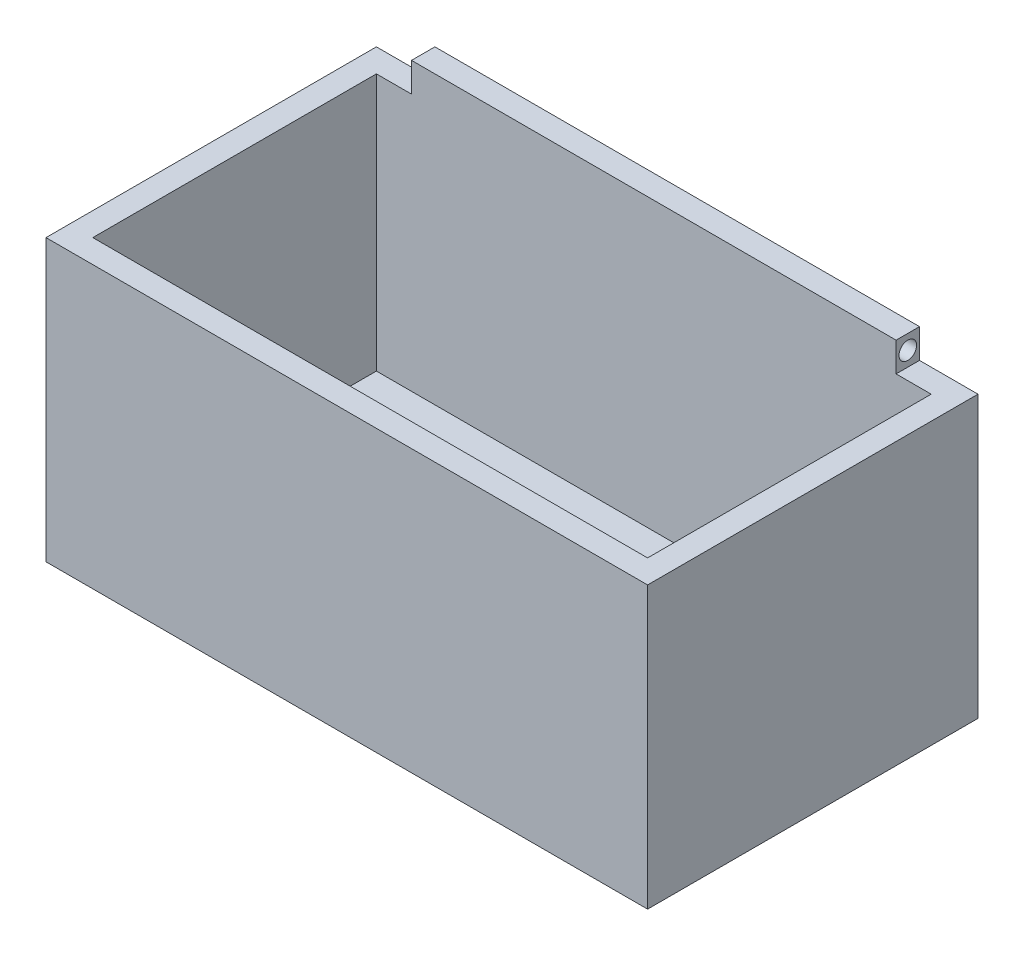
ISO-10303-21;
HEADER;
FILE_DESCRIPTION(('STEP AP214'),'2;1');
FILE_NAME('part.step','',(''),(''),'','','');
FILE_SCHEMA(('AUTOMOTIVE_DESIGN { 1 0 10303 214 1 1 1 1 }'));
ENDSEC;
DATA;
#1=APPLICATION_CONTEXT('core data for automotive mechanical design processes');
#2=APPLICATION_PROTOCOL_DEFINITION('international standard','automotive_design',2000,#1);
#3=PRODUCT_CONTEXT('',#1,'mechanical');
#4=PRODUCT('Part','Part','',(#3));
#5=PRODUCT_RELATED_PRODUCT_CATEGORY('part','',(#4));
#6=PRODUCT_DEFINITION_FORMATION('','',#4);
#7=PRODUCT_DEFINITION_CONTEXT('part definition',#1,'design');
#8=PRODUCT_DEFINITION('design','',#6,#7);
#9=PRODUCT_DEFINITION_SHAPE('','',#8);
#10=(LENGTH_UNIT() NAMED_UNIT(*) SI_UNIT(.MILLI.,.METRE.));
#11=(NAMED_UNIT(*) PLANE_ANGLE_UNIT() SI_UNIT($,.RADIAN.));
#12=(NAMED_UNIT(*) SI_UNIT($,.STERADIAN.) SOLID_ANGLE_UNIT());
#13=UNCERTAINTY_MEASURE_WITH_UNIT(LENGTH_MEASURE(1.E-05),#10,'distance_accuracy_value','');
#14=(GEOMETRIC_REPRESENTATION_CONTEXT(3) GLOBAL_UNCERTAINTY_ASSIGNED_CONTEXT((#13)) GLOBAL_UNIT_ASSIGNED_CONTEXT((#10,
#11,#12)) REPRESENTATION_CONTEXT('',''));
#15=CARTESIAN_POINT('',(0.,0.,0.));
#16=DIRECTION('',(0.,0.,1.));
#17=DIRECTION('',(1.,0.,0.));
#18=AXIS2_PLACEMENT_3D('',#15,#16,#17);
#19=CARTESIAN_POINT('',(-326.517,152.4,358.648));
#20=DIRECTION('',(0.,-1.,0.));
#21=DIRECTION('',(0.,0.,-1.));
#22=AXIS2_PLACEMENT_3D('',#19,#20,#21);
#23=PLANE('',#22);
#24=DIRECTION('',(0.,0.,-1.));
#25=VECTOR('',#24,1.);
#26=CARTESIAN_POINT('',(263.017,152.4,25.4));
#27=LINE('',#26,#25);
#28=CARTESIAN_POINT('',(263.017,152.4,25.4));
#29=VERTEX_POINT('',#28);
#30=CARTESIAN_POINT('',(263.017,152.4,0.));
#31=VERTEX_POINT('',#30);
#32=EDGE_CURVE('E56',#29,#31,#27,.T.);
#33=ORIENTED_EDGE('',*,*,#32,.F.);
#34=DIRECTION('',(-1.,0.,0.));
#35=VECTOR('',#34,1.);
#36=CARTESIAN_POINT('',(0.,152.4,25.4));
#37=LINE('',#36,#35);
#38=CARTESIAN_POINT('',(301.117,152.4,25.4));
#39=VERTEX_POINT('',#38);
#40=EDGE_CURVE('E178',#39,#29,#37,.T.);
#41=ORIENTED_EDGE('',*,*,#40,.F.);
#42=DIRECTION('',(0.,0.,-1.));
#43=VECTOR('',#42,1.);
#44=CARTESIAN_POINT('',(301.117,152.4,358.648));
#45=LINE('',#44,#43);
#46=CARTESIAN_POINT('',(301.117,152.4,333.248));
#47=VERTEX_POINT('',#46);
#48=EDGE_CURVE('E180',#47,#39,#45,.T.);
#49=ORIENTED_EDGE('',*,*,#48,.F.);
#50=DIRECTION('',(-1.,0.,0.));
#51=VECTOR('',#50,1.);
#52=CARTESIAN_POINT('',(0.,152.4,333.248));
#53=LINE('',#52,#51);
#54=CARTESIAN_POINT('',(-301.117,152.4,333.248));
#55=VERTEX_POINT('',#54);
#56=EDGE_CURVE('E163',#47,#55,#53,.T.);
#57=ORIENTED_EDGE('',*,*,#56,.T.);
#58=DIRECTION('',(0.,0.,-1.));
#59=VECTOR('',#58,1.);
#60=CARTESIAN_POINT('',(-301.117,152.4,358.648));
#61=LINE('',#60,#59);
#62=CARTESIAN_POINT('',(-301.117,152.4,25.4));
#63=VERTEX_POINT('',#62);
#64=EDGE_CURVE('E176',#55,#63,#61,.T.);
#65=ORIENTED_EDGE('',*,*,#64,.T.);
#66=CARTESIAN_POINT('',(-263.017,152.4,25.4));
#67=VERTEX_POINT('',#66);
#68=EDGE_CURVE('E155',#67,#63,#37,.T.);
#69=ORIENTED_EDGE('',*,*,#68,.F.);
#70=DIRECTION('',(0.,0.,1.));
#71=VECTOR('',#70,1.);
#72=CARTESIAN_POINT('',(-263.017,152.4,0.));
#73=LINE('',#72,#71);
#74=CARTESIAN_POINT('',(-263.017,152.4,0.));
#75=VERTEX_POINT('',#74);
#76=EDGE_CURVE('E63',#75,#67,#73,.T.);
#77=ORIENTED_EDGE('',*,*,#76,.F.);
#78=DIRECTION('',(-1.,0.,0.));
#79=VECTOR('',#78,1.);
#80=CARTESIAN_POINT('',(-326.517,152.4,0.));
#81=LINE('',#80,#79);
#82=CARTESIAN_POINT('',(-326.517,152.4,0.));
#83=VERTEX_POINT('',#82);
#84=EDGE_CURVE('E201',#75,#83,#81,.T.);
#85=ORIENTED_EDGE('',*,*,#84,.T.);
#86=DIRECTION('',(0.,0.,-1.));
#87=VECTOR('',#86,1.);
#88=CARTESIAN_POINT('',(-326.517,152.4,358.648));
#89=LINE('',#88,#87);
#90=CARTESIAN_POINT('',(-326.517,152.4,358.648));
#91=VERTEX_POINT('',#90);
#92=EDGE_CURVE('E49',#91,#83,#89,.T.);
#93=ORIENTED_EDGE('',*,*,#92,.F.);
#94=DIRECTION('',(-1.,0.,0.));
#95=VECTOR('',#94,1.);
#96=CARTESIAN_POINT('',(-326.517,152.4,358.648));
#97=LINE('',#96,#95);
#98=CARTESIAN_POINT('',(326.517,152.4,358.648));
#99=VERTEX_POINT('',#98);
#100=EDGE_CURVE('E191',#99,#91,#97,.T.);
#101=ORIENTED_EDGE('',*,*,#100,.F.);
#102=DIRECTION('',(0.,0.,-1.));
#103=VECTOR('',#102,1.);
#104=CARTESIAN_POINT('',(326.517,152.4,358.648));
#105=LINE('',#104,#103);
#106=CARTESIAN_POINT('',(326.517,152.4,0.));
#107=VERTEX_POINT('',#106);
#108=EDGE_CURVE('E11',#99,#107,#105,.T.);
#109=ORIENTED_EDGE('',*,*,#108,.T.);
#110=EDGE_CURVE('E202',#107,#31,#81,.T.);
#111=ORIENTED_EDGE('',*,*,#110,.T.);
#112=EDGE_LOOP('',(#33,#41,#49,#57,#65,#69,#77,#85,#93,#101,#109,#111));
#113=FACE_BOUND('',#112,.T.);
#114=ADVANCED_FACE('F41',(#113),#23,.F.);
#115=CARTESIAN_POINT('',(326.517,-152.4,358.648));
#116=DIRECTION('',(-1.,0.,0.));
#117=DIRECTION('',(0.,0.,1.));
#118=AXIS2_PLACEMENT_3D('',#115,#116,#117);
#119=PLANE('',#118);
#120=DIRECTION('',(0.,1.,0.));
#121=VECTOR('',#120,1.);
#122=CARTESIAN_POINT('',(326.517,-152.4,0.));
#123=LINE('',#122,#121);
#124=CARTESIAN_POINT('',(326.517,-152.4,0.));
#125=VERTEX_POINT('',#124);
#126=EDGE_CURVE('E182',#125,#107,#123,.T.);
#127=ORIENTED_EDGE('',*,*,#126,.T.);
#128=ORIENTED_EDGE('',*,*,#108,.F.);
#129=DIRECTION('',(0.,1.,0.));
#130=VECTOR('',#129,1.);
#131=CARTESIAN_POINT('',(326.517,-152.4,358.648));
#132=LINE('',#131,#130);
#133=CARTESIAN_POINT('',(326.517,-152.4,358.648));
#134=VERTEX_POINT('',#133);
#135=EDGE_CURVE('E188',#134,#99,#132,.T.);
#136=ORIENTED_EDGE('',*,*,#135,.F.);
#137=DIRECTION('',(0.,0.,-1.));
#138=VECTOR('',#137,1.);
#139=CARTESIAN_POINT('',(326.517,-152.4,358.648));
#140=LINE('',#139,#138);
#141=EDGE_CURVE('E198',#134,#125,#140,.T.);
#142=ORIENTED_EDGE('',*,*,#141,.T.);
#143=EDGE_LOOP('',(#127,#128,#136,#142));
#144=FACE_BOUND('',#143,.T.);
#145=ADVANCED_FACE('F43',(#144),#119,.F.);
#146=CARTESIAN_POINT('',(-326.517,-152.4,358.648));
#147=DIRECTION('',(1.,0.,0.));
#148=DIRECTION('',(0.,0.,-1.));
#149=AXIS2_PLACEMENT_3D('',#146,#147,#148);
#150=PLANE('',#149);
#151=DIRECTION('',(0.,-1.,0.));
#152=VECTOR('',#151,1.);
#153=CARTESIAN_POINT('',(-326.517,-152.4,0.));
#154=LINE('',#153,#152);
#155=CARTESIAN_POINT('',(-326.517,-152.4,0.));
#156=VERTEX_POINT('',#155);
#157=EDGE_CURVE('E204',#83,#156,#154,.T.);
#158=ORIENTED_EDGE('',*,*,#157,.T.);
#159=DIRECTION('',(0.,0.,-1.));
#160=VECTOR('',#159,1.);
#161=CARTESIAN_POINT('',(-326.517,-152.4,358.648));
#162=LINE('',#161,#160);
#163=CARTESIAN_POINT('',(-326.517,-152.4,358.648));
#164=VERTEX_POINT('',#163);
#165=EDGE_CURVE('E209',#164,#156,#162,.T.);
#166=ORIENTED_EDGE('',*,*,#165,.F.);
#167=DIRECTION('',(0.,-1.,0.));
#168=VECTOR('',#167,1.);
#169=CARTESIAN_POINT('',(-326.517,-152.4,358.648));
#170=LINE('',#169,#168);
#171=EDGE_CURVE('E194',#91,#164,#170,.T.);
#172=ORIENTED_EDGE('',*,*,#171,.F.);
#173=ORIENTED_EDGE('',*,*,#92,.T.);
#174=EDGE_LOOP('',(#158,#166,#172,#173));
#175=FACE_BOUND('',#174,.T.);
#176=ADVANCED_FACE('F216',(#175),#150,.F.);
#177=CARTESIAN_POINT('',(-326.517,-152.4,358.648));
#178=DIRECTION('',(0.,1.,0.));
#179=DIRECTION('',(0.,0.,1.));
#180=AXIS2_PLACEMENT_3D('',#177,#178,#179);
#181=PLANE('',#180);
#182=DIRECTION('',(1.,0.,0.));
#183=VECTOR('',#182,1.);
#184=CARTESIAN_POINT('',(-326.517,-152.4,0.));
#185=LINE('',#184,#183);
#186=EDGE_CURVE('E192',#156,#125,#185,.T.);
#187=ORIENTED_EDGE('',*,*,#186,.T.);
#188=ORIENTED_EDGE('',*,*,#141,.F.);
#189=DIRECTION('',(1.,0.,0.));
#190=VECTOR('',#189,1.);
#191=CARTESIAN_POINT('',(-326.517,-152.4,358.648));
#192=LINE('',#191,#190);
#193=EDGE_CURVE('E196',#164,#134,#192,.T.);
#194=ORIENTED_EDGE('',*,*,#193,.F.);
#195=ORIENTED_EDGE('',*,*,#165,.T.);
#196=EDGE_LOOP('',(#187,#188,#194,#195));
#197=FACE_BOUND('',#196,.T.);
#198=ADVANCED_FACE('F221',(#197),#181,.F.);
#199=CARTESIAN_POINT('',(0.,0.,358.648));
#200=DIRECTION('',(0.,0.,-1.));
#201=DIRECTION('',(-1.,0.,0.));
#202=AXIS2_PLACEMENT_3D('',#199,#200,#201);
#203=PLANE('',#202);
#204=ORIENTED_EDGE('',*,*,#135,.T.);
#205=ORIENTED_EDGE('',*,*,#100,.T.);
#206=ORIENTED_EDGE('',*,*,#171,.T.);
#207=ORIENTED_EDGE('',*,*,#193,.T.);
#208=EDGE_LOOP('',(#204,#205,#206,#207));
#209=FACE_BOUND('',#208,.T.);
#210=ADVANCED_FACE('F227',(#209),#203,.F.);
#211=CARTESIAN_POINT('',(0.,0.,0.));
#212=DIRECTION('',(0.,0.,-1.));
#213=DIRECTION('',(-1.,0.,0.));
#214=AXIS2_PLACEMENT_3D('',#211,#212,#213);
#215=PLANE('',#214);
#216=ORIENTED_EDGE('',*,*,#126,.F.);
#217=ORIENTED_EDGE('',*,*,#186,.F.);
#218=ORIENTED_EDGE('',*,*,#157,.F.);
#219=ORIENTED_EDGE('',*,*,#84,.F.);
#220=DIRECTION('',(0.,-1.,0.));
#221=VECTOR('',#220,1.);
#222=CARTESIAN_POINT('',(-263.017,184.15,0.));
#223=LINE('',#222,#221);
#224=CARTESIAN_POINT('',(-263.017,184.15,0.));
#225=VERTEX_POINT('',#224);
#226=EDGE_CURVE('E137',#225,#75,#223,.T.);
#227=ORIENTED_EDGE('',*,*,#226,.F.);
#228=DIRECTION('',(-1.,0.,0.));
#229=VECTOR('',#228,1.);
#230=CARTESIAN_POINT('',(-263.017,184.15,0.));
#231=LINE('',#230,#229);
#232=CARTESIAN_POINT('',(263.017,184.15,-1.62114604292954E-13));
#233=VERTEX_POINT('',#232);
#234=EDGE_CURVE('E130',#233,#225,#231,.T.);
#235=ORIENTED_EDGE('',*,*,#234,.F.);
#236=DIRECTION('',(0.,-1.,0.));
#237=VECTOR('',#236,1.);
#238=CARTESIAN_POINT('',(263.017,184.15,-1.62114604292954E-13));
#239=LINE('',#238,#237);
#240=EDGE_CURVE('E135',#233,#31,#239,.T.);
#241=ORIENTED_EDGE('',*,*,#240,.T.);
#242=ORIENTED_EDGE('',*,*,#110,.F.);
#243=EDGE_LOOP('',(#216,#217,#218,#219,#227,#235,#241,#242));
#244=FACE_BOUND('',#243,.T.);
#245=ADVANCED_FACE('F133',(#244),#215,.T.);
#246=CARTESIAN_POINT('',(301.117,-152.4,358.648));
#247=DIRECTION('',(-1.,0.,0.));
#248=DIRECTION('',(0.,0.,1.));
#249=AXIS2_PLACEMENT_3D('',#246,#247,#248);
#250=PLANE('',#249);
#251=DIRECTION('',(0.,1.,0.));
#252=VECTOR('',#251,1.);
#253=CARTESIAN_POINT('',(301.117,0.,25.4));
#254=LINE('',#253,#252);
#255=CARTESIAN_POINT('',(301.117,-127.,25.4));
#256=VERTEX_POINT('',#255);
#257=EDGE_CURVE('E152',#256,#39,#254,.T.);
#258=ORIENTED_EDGE('',*,*,#257,.F.);
#259=DIRECTION('',(0.,0.,-1.));
#260=VECTOR('',#259,1.);
#261=CARTESIAN_POINT('',(301.117,-127.,358.648));
#262=LINE('',#261,#260);
#263=CARTESIAN_POINT('',(301.117,-127.,333.248));
#264=VERTEX_POINT('',#263);
#265=EDGE_CURVE('E165',#264,#256,#262,.T.);
#266=ORIENTED_EDGE('',*,*,#265,.F.);
#267=DIRECTION('',(0.,1.,0.));
#268=VECTOR('',#267,1.);
#269=CARTESIAN_POINT('',(301.117,0.,333.248));
#270=LINE('',#269,#268);
#271=EDGE_CURVE('E161',#264,#47,#270,.T.);
#272=ORIENTED_EDGE('',*,*,#271,.T.);
#273=ORIENTED_EDGE('',*,*,#48,.T.);
#274=EDGE_LOOP('',(#258,#266,#272,#273));
#275=FACE_BOUND('',#274,.T.);
#276=ADVANCED_FACE('F240',(#275),#250,.T.);
#277=CARTESIAN_POINT('',(-301.117,-152.4,358.648));
#278=DIRECTION('',(1.,0.,0.));
#279=DIRECTION('',(0.,0.,-1.));
#280=AXIS2_PLACEMENT_3D('',#277,#278,#279);
#281=PLANE('',#280);
#282=DIRECTION('',(0.,-1.,0.));
#283=VECTOR('',#282,1.);
#284=CARTESIAN_POINT('',(-301.117,0.,25.4));
#285=LINE('',#284,#283);
#286=CARTESIAN_POINT('',(-301.117,-127.,25.4));
#287=VERTEX_POINT('',#286);
#288=EDGE_CURVE('E171',#63,#287,#285,.T.);
#289=ORIENTED_EDGE('',*,*,#288,.F.);
#290=ORIENTED_EDGE('',*,*,#64,.F.);
#291=DIRECTION('',(0.,-1.,0.));
#292=VECTOR('',#291,1.);
#293=CARTESIAN_POINT('',(-301.117,0.,333.248));
#294=LINE('',#293,#292);
#295=CARTESIAN_POINT('',(-301.117,-127.,333.248));
#296=VERTEX_POINT('',#295);
#297=EDGE_CURVE('E173',#55,#296,#294,.T.);
#298=ORIENTED_EDGE('',*,*,#297,.T.);
#299=DIRECTION('',(0.,0.,-1.));
#300=VECTOR('',#299,1.);
#301=CARTESIAN_POINT('',(-301.117,-127.,358.648));
#302=LINE('',#301,#300);
#303=EDGE_CURVE('E168',#296,#287,#302,.T.);
#304=ORIENTED_EDGE('',*,*,#303,.T.);
#305=EDGE_LOOP('',(#289,#290,#298,#304));
#306=FACE_BOUND('',#305,.T.);
#307=ADVANCED_FACE('F253',(#306),#281,.T.);
#308=CARTESIAN_POINT('',(-326.517,-127.,358.648));
#309=DIRECTION('',(0.,1.,0.));
#310=DIRECTION('',(0.,0.,1.));
#311=AXIS2_PLACEMENT_3D('',#308,#309,#310);
#312=PLANE('',#311);
#313=DIRECTION('',(1.,0.,0.));
#314=VECTOR('',#313,1.);
#315=CARTESIAN_POINT('',(0.,-127.,25.4));
#316=LINE('',#315,#314);
#317=EDGE_CURVE('E164',#287,#256,#316,.T.);
#318=ORIENTED_EDGE('',*,*,#317,.F.);
#319=ORIENTED_EDGE('',*,*,#303,.F.);
#320=DIRECTION('',(1.,0.,0.));
#321=VECTOR('',#320,1.);
#322=CARTESIAN_POINT('',(0.,-127.,333.248));
#323=LINE('',#322,#321);
#324=EDGE_CURVE('E169',#296,#264,#323,.T.);
#325=ORIENTED_EDGE('',*,*,#324,.T.);
#326=ORIENTED_EDGE('',*,*,#265,.T.);
#327=EDGE_LOOP('',(#318,#319,#325,#326));
#328=FACE_BOUND('',#327,.T.);
#329=ADVANCED_FACE('F249',(#328),#312,.T.);
#330=CARTESIAN_POINT('',(0.,0.,333.248));
#331=DIRECTION('',(0.,0.,-1.));
#332=DIRECTION('',(-1.,0.,0.));
#333=AXIS2_PLACEMENT_3D('',#330,#331,#332);
#334=PLANE('',#333);
#335=ORIENTED_EDGE('',*,*,#271,.F.);
#336=ORIENTED_EDGE('',*,*,#324,.F.);
#337=ORIENTED_EDGE('',*,*,#297,.F.);
#338=ORIENTED_EDGE('',*,*,#56,.F.);
#339=EDGE_LOOP('',(#335,#336,#337,#338));
#340=FACE_BOUND('',#339,.T.);
#341=ADVANCED_FACE('F246',(#340),#334,.T.);
#342=CARTESIAN_POINT('',(0.,0.,25.4));
#343=DIRECTION('',(0.,0.,-1.));
#344=DIRECTION('',(-1.,0.,0.));
#345=AXIS2_PLACEMENT_3D('',#342,#343,#344);
#346=PLANE('',#345);
#347=ORIENTED_EDGE('',*,*,#257,.T.);
#348=ORIENTED_EDGE('',*,*,#40,.T.);
#349=DIRECTION('',(0.,-1.,0.));
#350=VECTOR('',#349,1.);
#351=CARTESIAN_POINT('',(263.017,184.15,25.4));
#352=LINE('',#351,#350);
#353=CARTESIAN_POINT('',(263.017,184.15,25.4));
#354=VERTEX_POINT('',#353);
#355=EDGE_CURVE('E303',#354,#29,#352,.T.);
#356=ORIENTED_EDGE('',*,*,#355,.F.);
#357=DIRECTION('',(1.,0.,0.));
#358=VECTOR('',#357,1.);
#359=CARTESIAN_POINT('',(-263.017,184.15,25.4));
#360=LINE('',#359,#358);
#361=CARTESIAN_POINT('',(-263.017,184.15,25.4));
#362=VERTEX_POINT('',#361);
#363=EDGE_CURVE('E146',#362,#354,#360,.T.);
#364=ORIENTED_EDGE('',*,*,#363,.F.);
#365=DIRECTION('',(0.,-1.,0.));
#366=VECTOR('',#365,1.);
#367=CARTESIAN_POINT('',(-263.017,184.15,25.4));
#368=LINE('',#367,#366);
#369=EDGE_CURVE('E157',#362,#67,#368,.T.);
#370=ORIENTED_EDGE('',*,*,#369,.T.);
#371=ORIENTED_EDGE('',*,*,#68,.T.);
#372=ORIENTED_EDGE('',*,*,#288,.T.);
#373=ORIENTED_EDGE('',*,*,#317,.T.);
#374=EDGE_LOOP('',(#347,#348,#356,#364,#370,#371,#372,#373));
#375=FACE_BOUND('',#374,.T.);
#376=ADVANCED_FACE('F243',(#375),#346,.F.);
#377=CARTESIAN_POINT('',(263.017,184.15,25.4));
#378=DIRECTION('',(-1.,0.,0.));
#379=DIRECTION('',(0.,0.,1.));
#380=AXIS2_PLACEMENT_3D('',#377,#378,#379);
#381=PLANE('',#380);
#382=CARTESIAN_POINT('',(263.017,168.275,12.6999999999999));
#383=DIRECTION('',(1.,0.,0.));
#384=DIRECTION('',(0.,0.,-1.));
#385=AXIS2_PLACEMENT_3D('',#382,#383,#384);
#386=CIRCLE('',#385,9.525);
#387=CARTESIAN_POINT('',(263.017,168.275,3.17499999999992));
#388=VERTEX_POINT('',#387);
#389=EDGE_CURVE('E290',#388,#388,#386,.T.);
#390=ORIENTED_EDGE('',*,*,#389,.F.);
#391=EDGE_LOOP('',(#390));
#392=FACE_BOUND('',#391,.T.);
#393=ORIENTED_EDGE('',*,*,#32,.T.);
#394=ORIENTED_EDGE('',*,*,#240,.F.);
#395=DIRECTION('',(0.,0.,-1.));
#396=VECTOR('',#395,1.);
#397=CARTESIAN_POINT('',(263.017,184.15,25.4));
#398=LINE('',#397,#396);
#399=EDGE_CURVE('E141',#354,#233,#398,.T.);
#400=ORIENTED_EDGE('',*,*,#399,.F.);
#401=ORIENTED_EDGE('',*,*,#355,.T.);
#402=EDGE_LOOP('',(#393,#394,#400,#401));
#403=FACE_BOUND('',#402,.T.);
#404=ADVANCED_FACE('F151',(#392,#403),#381,.F.);
#405=CARTESIAN_POINT('',(-263.017,184.15,0.));
#406=DIRECTION('',(1.,0.,0.));
#407=DIRECTION('',(0.,0.,-1.));
#408=AXIS2_PLACEMENT_3D('',#405,#406,#407);
#409=PLANE('',#408);
#410=CARTESIAN_POINT('',(-263.017,168.275,12.6999999999999));
#411=DIRECTION('',(1.,0.,0.));
#412=DIRECTION('',(0.,0.,-1.));
#413=AXIS2_PLACEMENT_3D('',#410,#411,#412);
#414=CIRCLE('',#413,9.525);
#415=CARTESIAN_POINT('',(-263.017,168.275,3.17499999999992));
#416=VERTEX_POINT('',#415);
#417=EDGE_CURVE('E291',#416,#416,#414,.T.);
#418=ORIENTED_EDGE('',*,*,#417,.T.);
#419=EDGE_LOOP('',(#418));
#420=FACE_BOUND('',#419,.T.);
#421=ORIENTED_EDGE('',*,*,#76,.T.);
#422=ORIENTED_EDGE('',*,*,#369,.F.);
#423=DIRECTION('',(0.,0.,1.));
#424=VECTOR('',#423,1.);
#425=CARTESIAN_POINT('',(-263.017,184.15,0.));
#426=LINE('',#425,#424);
#427=EDGE_CURVE('E140',#225,#362,#426,.T.);
#428=ORIENTED_EDGE('',*,*,#427,.F.);
#429=ORIENTED_EDGE('',*,*,#226,.T.);
#430=EDGE_LOOP('',(#421,#422,#428,#429));
#431=FACE_BOUND('',#430,.T.);
#432=ADVANCED_FACE('F263',(#420,#431),#409,.F.);
#433=CARTESIAN_POINT('',(0.,184.15,0.));
#434=DIRECTION('',(0.,-1.,0.));
#435=DIRECTION('',(0.,0.,-1.));
#436=AXIS2_PLACEMENT_3D('',#433,#434,#435);
#437=PLANE('',#436);
#438=ORIENTED_EDGE('',*,*,#399,.T.);
#439=ORIENTED_EDGE('',*,*,#234,.T.);
#440=ORIENTED_EDGE('',*,*,#427,.T.);
#441=ORIENTED_EDGE('',*,*,#363,.T.);
#442=EDGE_LOOP('',(#438,#439,#440,#441));
#443=FACE_BOUND('',#442,.T.);
#444=ADVANCED_FACE('F144',(#443),#437,.F.);
#445=CARTESIAN_POINT('',(237.617,168.275,12.6999999999999));
#446=DIRECTION('',(1.,0.,0.));
#447=DIRECTION('',(0.,0.,-1.));
#448=AXIS2_PLACEMENT_3D('',#445,#446,#447);
#449=CYLINDRICAL_SURFACE('',#448,9.525);
#450=CARTESIAN_POINT('',(237.617,168.275,12.6999999999999));
#451=DIRECTION('',(1.,0.,0.));
#452=DIRECTION('',(0.,0.,-1.));
#453=AXIS2_PLACEMENT_3D('',#450,#451,#452);
#454=CIRCLE('',#453,9.525);
#455=CARTESIAN_POINT('',(237.617,168.275,3.17499999999992));
#456=VERTEX_POINT('',#455);
#457=EDGE_CURVE('E294',#456,#456,#454,.T.);
#458=ORIENTED_EDGE('',*,*,#457,.F.);
#459=EDGE_LOOP('',(#458));
#460=FACE_BOUND('',#459,.T.);
#461=ORIENTED_EDGE('',*,*,#389,.T.);
#462=EDGE_LOOP('',(#461));
#463=FACE_BOUND('',#462,.T.);
#464=ADVANCED_FACE('F270',(#460,#463),#449,.F.);
#465=CARTESIAN_POINT('',(237.617,168.275,12.6999999999999));
#466=DIRECTION('',(1.,0.,0.));
#467=DIRECTION('',(0.,0.,-1.));
#468=AXIS2_PLACEMENT_3D('',#465,#466,#467);
#469=PLANE('',#468);
#470=ORIENTED_EDGE('',*,*,#457,.T.);
#471=EDGE_LOOP('',(#470));
#472=FACE_BOUND('',#471,.T.);
#473=ADVANCED_FACE('F273',(#472),#469,.T.);
#474=CARTESIAN_POINT('',(-237.617,168.275,12.6999999999999));
#475=DIRECTION('',(-1.,0.,0.));
#476=DIRECTION('',(0.,0.,1.));
#477=AXIS2_PLACEMENT_3D('',#474,#475,#476);
#478=CYLINDRICAL_SURFACE('',#477,9.525);
#479=CARTESIAN_POINT('',(-237.617,168.275,12.6999999999999));
#480=DIRECTION('',(1.,0.,0.));
#481=DIRECTION('',(0.,0.,-1.));
#482=AXIS2_PLACEMENT_3D('',#479,#480,#481);
#483=CIRCLE('',#482,9.525);
#484=CARTESIAN_POINT('',(-237.617,168.275,3.17499999999992));
#485=VERTEX_POINT('',#484);
#486=EDGE_CURVE('E289',#485,#485,#483,.T.);
#487=ORIENTED_EDGE('',*,*,#486,.T.);
#488=EDGE_LOOP('',(#487));
#489=FACE_BOUND('',#488,.T.);
#490=ORIENTED_EDGE('',*,*,#417,.F.);
#491=EDGE_LOOP('',(#490));
#492=FACE_BOUND('',#491,.T.);
#493=ADVANCED_FACE('F277',(#489,#492),#478,.F.);
#494=CARTESIAN_POINT('',(-237.617,168.275,12.6999999999999));
#495=DIRECTION('',(-1.,0.,0.));
#496=DIRECTION('',(0.,0.,-1.));
#497=AXIS2_PLACEMENT_3D('',#494,#495,#496);
#498=PLANE('',#497);
#499=ORIENTED_EDGE('',*,*,#486,.F.);
#500=EDGE_LOOP('',(#499));
#501=FACE_BOUND('',#500,.T.);
#502=ADVANCED_FACE('F281',(#501),#498,.T.);
#503=CLOSED_SHELL('',(#114,#145,#176,#198,#210,#245,#276,#307,#329,#341,#376,#404,#432,#444,
#464,#473,#493,#502));
#504=MANIFOLD_SOLID_BREP('B2',#503);
#505=ADVANCED_BREP_SHAPE_REPRESENTATION('',(#18,#504),#14);
#506=SHAPE_DEFINITION_REPRESENTATION(#9,#505);
ENDSEC;
END-ISO-10303-21;
